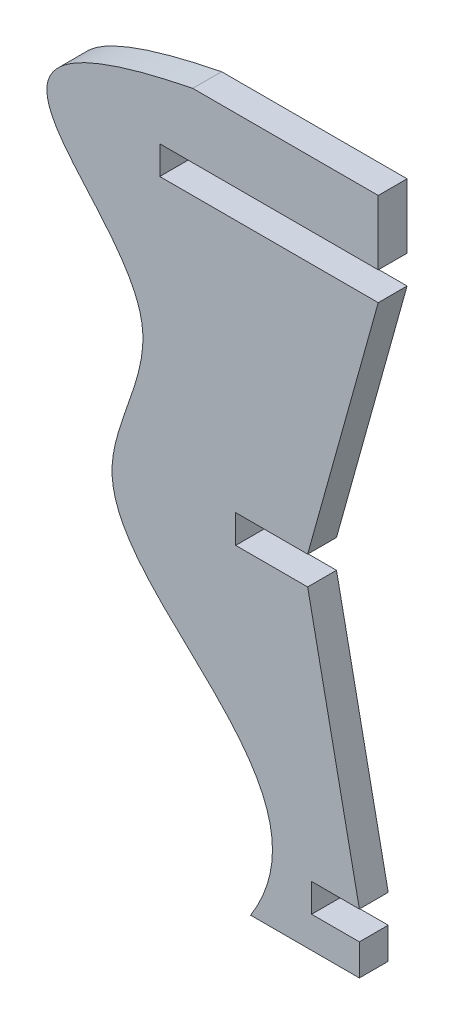
ISO-10303-21;
HEADER;
FILE_DESCRIPTION(('STEP AP214'),'2;1');
FILE_NAME('part.step','',(''),(''),'','','');
FILE_SCHEMA(('AUTOMOTIVE_DESIGN { 1 0 10303 214 1 1 1 1 }'));
ENDSEC;
DATA;
#1=APPLICATION_CONTEXT('core data for automotive mechanical design processes');
#2=APPLICATION_PROTOCOL_DEFINITION('international standard','automotive_design',2000,#1);
#3=PRODUCT_CONTEXT('',#1,'mechanical');
#4=PRODUCT('Part','Part','',(#3));
#5=PRODUCT_RELATED_PRODUCT_CATEGORY('part','',(#4));
#6=PRODUCT_DEFINITION_FORMATION('','',#4);
#7=PRODUCT_DEFINITION_CONTEXT('part definition',#1,'design');
#8=PRODUCT_DEFINITION('design','',#6,#7);
#9=PRODUCT_DEFINITION_SHAPE('','',#8);
#10=(LENGTH_UNIT() NAMED_UNIT(*) SI_UNIT(.MILLI.,.METRE.));
#11=(NAMED_UNIT(*) PLANE_ANGLE_UNIT() SI_UNIT($,.RADIAN.));
#12=(NAMED_UNIT(*) SI_UNIT($,.STERADIAN.) SOLID_ANGLE_UNIT());
#13=UNCERTAINTY_MEASURE_WITH_UNIT(LENGTH_MEASURE(1.E-05),#10,'distance_accuracy_value','');
#14=(GEOMETRIC_REPRESENTATION_CONTEXT(3) GLOBAL_UNCERTAINTY_ASSIGNED_CONTEXT((#13)) GLOBAL_UNIT_ASSIGNED_CONTEXT((#10,
#11,#12)) REPRESENTATION_CONTEXT('',''));
#15=CARTESIAN_POINT('',(0.,0.,0.));
#16=DIRECTION('',(0.,0.,1.));
#17=DIRECTION('',(1.,0.,0.));
#18=AXIS2_PLACEMENT_3D('',#15,#16,#17);
#19=CARTESIAN_POINT('',(-25.8057222674,61.31,5.7));
#20=DIRECTION('',(-0.963245382122219,0.268623032929456,0.));
#21=DIRECTION('',(-0.268623032929456,-0.96324538212222,0.));
#22=AXIS2_PLACEMENT_3D('',#19,#20,#21);
#23=PLANE('',#22);
#24=DIRECTION('',(0.268623032929456,0.963245382122219,0.));
#25=VECTOR('',#24,1.);
#26=CARTESIAN_POINT('',(-25.8057222674,61.31,0.));
#27=LINE('',#26,#25);
#28=CARTESIAN_POINT('',(-25.8057222674,61.31,0.));
#29=VERTEX_POINT('',#28);
#30=CARTESIAN_POINT('',(-11.8620772775,111.31,0.));
#31=VERTEX_POINT('',#30);
#32=EDGE_CURVE('E177',#29,#31,#27,.T.);
#33=ORIENTED_EDGE('',*,*,#32,.T.);
#34=DIRECTION('',(0.,0.,-1.));
#35=VECTOR('',#34,1.);
#36=CARTESIAN_POINT('',(-11.8620772775,111.31,5.7));
#37=LINE('',#36,#35);
#38=CARTESIAN_POINT('',(-11.8620772775,111.31,5.7));
#39=VERTEX_POINT('',#38);
#40=EDGE_CURVE('E11',#39,#31,#37,.T.);
#41=ORIENTED_EDGE('',*,*,#40,.F.);
#42=DIRECTION('',(0.268623032929456,0.963245382122219,0.));
#43=VECTOR('',#42,1.);
#44=CARTESIAN_POINT('',(-25.8057222674,61.31,5.7));
#45=LINE('',#44,#43);
#46=CARTESIAN_POINT('',(-25.8057222674,61.31,5.7));
#47=VERTEX_POINT('',#46);
#48=EDGE_CURVE('E216',#47,#39,#45,.T.);
#49=ORIENTED_EDGE('',*,*,#48,.F.);
#50=DIRECTION('',(0.,0.,-1.));
#51=VECTOR('',#50,1.);
#52=CARTESIAN_POINT('',(-25.8057222674,61.31,5.7));
#53=LINE('',#52,#51);
#54=EDGE_CURVE('E173',#47,#29,#53,.T.);
#55=ORIENTED_EDGE('',*,*,#54,.T.);
#56=EDGE_LOOP('',(#33,#41,#49,#55));
#57=FACE_BOUND('',#56,.T.);
#58=ADVANCED_FACE('F33',(#57),#23,.F.);
#59=CARTESIAN_POINT('',(-11.8620772775,111.31,5.7));
#60=DIRECTION('',(0.,-1.,0.));
#61=DIRECTION('',(0.,0.,-1.));
#62=AXIS2_PLACEMENT_3D('',#59,#60,#61);
#63=PLANE('',#62);
#64=DIRECTION('',(-1.,0.,0.));
#65=VECTOR('',#64,1.);
#66=CARTESIAN_POINT('',(-11.8620772775,111.31,0.));
#67=LINE('',#66,#65);
#68=CARTESIAN_POINT('',(-55.0225,111.31,0.));
#69=VERTEX_POINT('',#68);
#70=EDGE_CURVE('E180',#31,#69,#67,.T.);
#71=ORIENTED_EDGE('',*,*,#70,.T.);
#72=DIRECTION('',(0.,0.,-1.));
#73=VECTOR('',#72,1.);
#74=CARTESIAN_POINT('',(-55.0225,111.31,5.7));
#75=LINE('',#74,#73);
#76=CARTESIAN_POINT('',(-55.0225,111.31,5.7));
#77=VERTEX_POINT('',#76);
#78=EDGE_CURVE('E41',#77,#69,#75,.T.);
#79=ORIENTED_EDGE('',*,*,#78,.F.);
#80=DIRECTION('',(-1.,0.,0.));
#81=VECTOR('',#80,1.);
#82=CARTESIAN_POINT('',(-11.8620772775,111.31,5.7));
#83=LINE('',#82,#81);
#84=EDGE_CURVE('E116',#39,#77,#83,.T.);
#85=ORIENTED_EDGE('',*,*,#84,.F.);
#86=ORIENTED_EDGE('',*,*,#40,.T.);
#87=EDGE_LOOP('',(#71,#79,#85,#86));
#88=FACE_BOUND('',#87,.T.);
#89=ADVANCED_FACE('F303',(#88),#63,.F.);
#90=CARTESIAN_POINT('',(-55.0225,111.31,5.7));
#91=DIRECTION('',(-1.,0.,0.));
#92=DIRECTION('',(0.,0.,1.));
#93=AXIS2_PLACEMENT_3D('',#90,#91,#92);
#94=PLANE('',#93);
#95=DIRECTION('',(0.,1.,0.));
#96=VECTOR('',#95,1.);
#97=CARTESIAN_POINT('',(-55.0225,111.31,0.));
#98=LINE('',#97,#96);
#99=CARTESIAN_POINT('',(-55.0225,116.92,0.));
#100=VERTEX_POINT('',#99);
#101=EDGE_CURVE('E182',#69,#100,#98,.T.);
#102=ORIENTED_EDGE('',*,*,#101,.T.);
#103=DIRECTION('',(0.,0.,-1.));
#104=VECTOR('',#103,1.);
#105=CARTESIAN_POINT('',(-55.0225,116.92,5.7));
#106=LINE('',#105,#104);
#107=CARTESIAN_POINT('',(-55.0225,116.92,5.7));
#108=VERTEX_POINT('',#107);
#109=EDGE_CURVE('E243',#108,#100,#106,.T.);
#110=ORIENTED_EDGE('',*,*,#109,.F.);
#111=DIRECTION('',(0.,1.,0.));
#112=VECTOR('',#111,1.);
#113=CARTESIAN_POINT('',(-55.0225,111.31,5.7));
#114=LINE('',#113,#112);
#115=EDGE_CURVE('E251',#77,#108,#114,.T.);
#116=ORIENTED_EDGE('',*,*,#115,.F.);
#117=ORIENTED_EDGE('',*,*,#78,.T.);
#118=EDGE_LOOP('',(#102,#110,#116,#117));
#119=FACE_BOUND('',#118,.T.);
#120=ADVANCED_FACE('F249',(#119),#94,.F.);
#121=CARTESIAN_POINT('',(-55.0225,116.92,5.7));
#122=DIRECTION('',(0.,1.,0.));
#123=DIRECTION('',(0.,0.,1.));
#124=AXIS2_PLACEMENT_3D('',#121,#122,#123);
#125=PLANE('',#124);
#126=DIRECTION('',(1.,0.,0.));
#127=VECTOR('',#126,1.);
#128=CARTESIAN_POINT('',(-55.0225,116.92,0.));
#129=LINE('',#128,#127);
#130=CARTESIAN_POINT('',(-11.8620772775,116.92,0.));
#131=VERTEX_POINT('',#130);
#132=EDGE_CURVE('E184',#100,#131,#129,.T.);
#133=ORIENTED_EDGE('',*,*,#132,.T.);
#134=DIRECTION('',(0.,0.,-1.));
#135=VECTOR('',#134,1.);
#136=CARTESIAN_POINT('',(-11.8620772775,116.92,5.7));
#137=LINE('',#136,#135);
#138=CARTESIAN_POINT('',(-11.8620772775,116.92,5.7));
#139=VERTEX_POINT('',#138);
#140=EDGE_CURVE('E240',#139,#131,#137,.T.);
#141=ORIENTED_EDGE('',*,*,#140,.F.);
#142=DIRECTION('',(1.,0.,0.));
#143=VECTOR('',#142,1.);
#144=CARTESIAN_POINT('',(-55.0225,116.92,5.7));
#145=LINE('',#144,#143);
#146=EDGE_CURVE('E269',#108,#139,#145,.T.);
#147=ORIENTED_EDGE('',*,*,#146,.F.);
#148=ORIENTED_EDGE('',*,*,#109,.T.);
#149=EDGE_LOOP('',(#133,#141,#147,#148));
#150=FACE_BOUND('',#149,.T.);
#151=ADVANCED_FACE('F260',(#150),#125,.F.);
#152=CARTESIAN_POINT('',(-11.8620772775,116.92,5.7));
#153=DIRECTION('',(-1.,0.,0.));
#154=DIRECTION('',(0.,0.,1.));
#155=AXIS2_PLACEMENT_3D('',#152,#153,#154);
#156=PLANE('',#155);
#157=DIRECTION('',(0.,1.,0.));
#158=VECTOR('',#157,1.);
#159=CARTESIAN_POINT('',(-11.8620772775,116.92,0.));
#160=LINE('',#159,#158);
#161=CARTESIAN_POINT('',(-11.8620772775,129.6505378366,0.));
#162=VERTEX_POINT('',#161);
#163=EDGE_CURVE('E186',#131,#162,#160,.T.);
#164=ORIENTED_EDGE('',*,*,#163,.T.);
#165=DIRECTION('',(0.,0.,-1.));
#166=VECTOR('',#165,1.);
#167=CARTESIAN_POINT('',(-11.8620772775,129.6505378366,5.7));
#168=LINE('',#167,#166);
#169=CARTESIAN_POINT('',(-11.8620772775,129.6505378366,5.7));
#170=VERTEX_POINT('',#169);
#171=EDGE_CURVE('E237',#170,#162,#168,.T.);
#172=ORIENTED_EDGE('',*,*,#171,.F.);
#173=DIRECTION('',(0.,1.,0.));
#174=VECTOR('',#173,1.);
#175=CARTESIAN_POINT('',(-11.8620772775,116.92,5.7));
#176=LINE('',#175,#174);
#177=EDGE_CURVE('E266',#139,#170,#176,.T.);
#178=ORIENTED_EDGE('',*,*,#177,.F.);
#179=ORIENTED_EDGE('',*,*,#140,.T.);
#180=EDGE_LOOP('',(#164,#172,#178,#179));
#181=FACE_BOUND('',#180,.T.);
#182=ADVANCED_FACE('F264',(#181),#156,.F.);
#183=CARTESIAN_POINT('',(-11.8620772775,129.6505378366,5.7));
#184=DIRECTION('',(0.,-1.,0.));
#185=DIRECTION('',(0.,0.,-1.));
#186=AXIS2_PLACEMENT_3D('',#183,#184,#185);
#187=PLANE('',#186);
#188=DIRECTION('',(-1.,0.,0.));
#189=VECTOR('',#188,1.);
#190=CARTESIAN_POINT('',(-11.8620772775,129.6505378366,0.));
#191=LINE('',#190,#189);
#192=CARTESIAN_POINT('',(-48.5078657711,129.6505378366,0.));
#193=VERTEX_POINT('',#192);
#194=EDGE_CURVE('E188',#162,#193,#191,.T.);
#195=ORIENTED_EDGE('',*,*,#194,.T.);
#196=DIRECTION('',(0.,0.,-1.));
#197=VECTOR('',#196,1.);
#198=CARTESIAN_POINT('',(-48.5078657711,129.6505378366,5.7));
#199=LINE('',#198,#197);
#200=CARTESIAN_POINT('',(-48.5078657711,129.6505378366,5.7));
#201=VERTEX_POINT('',#200);
#202=EDGE_CURVE('E235',#201,#193,#199,.T.);
#203=ORIENTED_EDGE('',*,*,#202,.F.);
#204=DIRECTION('',(-1.,0.,0.));
#205=VECTOR('',#204,1.);
#206=CARTESIAN_POINT('',(-11.8620772775,129.6505378366,5.7));
#207=LINE('',#206,#205);
#208=EDGE_CURVE('E268',#170,#201,#207,.T.);
#209=ORIENTED_EDGE('',*,*,#208,.F.);
#210=ORIENTED_EDGE('',*,*,#171,.T.);
#211=EDGE_LOOP('',(#195,#203,#209,#210));
#212=FACE_BOUND('',#211,.T.);
#213=ADVANCED_FACE('F292',(#212),#187,.F.);
#214=CARTESIAN_POINT('',(-37.0751711553,-6.09831367439999,5.7));
#215=CARTESIAN_POINT('',(-18.9326705850336,22.9975941406558,5.7));
#216=CARTESIAN_POINT('',(-82.5226304522793,39.7802684786298,5.7));
#217=CARTESIAN_POINT('',(-40.9715397059702,97.4969415458104,5.7));
#218=CARTESIAN_POINT('',(-105.285323280838,118.285278382174,5.7));
#219=CARTESIAN_POINT('',(-48.5078657711,129.6505378366,5.7));
#220=B_SPLINE_CURVE_WITH_KNOTS('',3,(#214,#215,#216,#217,#218,#219),.UNSPECIFIED.,.F.,.F.,(4,1,
1,4),(0.,0.428706620477407,0.60744609459787,1.),.UNSPECIFIED.);
#221=DIRECTION('',(0.,0.,-1.));
#222=VECTOR('',#221,1.);
#223=SURFACE_OF_LINEAR_EXTRUSION('',#220,#222);
#224=CARTESIAN_POINT('',(-37.0751711553,-6.09831367439999,0.));
#225=CARTESIAN_POINT('',(-18.9326705850336,22.9975941406558,0.));
#226=CARTESIAN_POINT('',(-82.5226304522793,39.7802684786298,0.));
#227=CARTESIAN_POINT('',(-40.9715397059702,97.4969415458104,0.));
#228=CARTESIAN_POINT('',(-105.285323280838,118.285278382174,0.));
#229=CARTESIAN_POINT('',(-48.5078657711,129.6505378366,0.));
#230=B_SPLINE_CURVE_WITH_KNOTS('',3,(#224,#225,#226,#227,#228,#229),.UNSPECIFIED.,.F.,.F.,(4,1,
1,4),(0.,0.428706620477407,0.60744609459787,1.),.UNSPECIFIED.);
#231=CARTESIAN_POINT('',(-37.0751711553,-6.09831367439999,0.));
#232=VERTEX_POINT('',#231);
#233=EDGE_CURVE('E191',#232,#193,#230,.T.);
#234=ORIENTED_EDGE('',*,*,#233,.F.);
#235=DIRECTION('',(0.,0.,-1.));
#236=VECTOR('',#235,1.);
#237=CARTESIAN_POINT('',(-37.0751711553,-6.09831367439999,5.7));
#238=LINE('',#237,#236);
#239=CARTESIAN_POINT('',(-37.0751711553,-6.09831367439999,5.7));
#240=VERTEX_POINT('',#239);
#241=EDGE_CURVE('E233',#240,#232,#238,.T.);
#242=ORIENTED_EDGE('',*,*,#241,.F.);
#243=EDGE_CURVE('E271',#240,#201,#220,.T.);
#244=ORIENTED_EDGE('',*,*,#243,.T.);
#245=ORIENTED_EDGE('',*,*,#202,.T.);
#246=EDGE_LOOP('',(#234,#242,#244,#245));
#247=FACE_BOUND('',#246,.T.);
#248=ADVANCED_FACE('F287',(#247),#223,.T.);
#249=CARTESIAN_POINT('',(-15.5909572032,-6.09831367440001,5.7));
#250=DIRECTION('',(0.,-1.,0.));
#251=DIRECTION('',(0.,0.,-1.));
#252=AXIS2_PLACEMENT_3D('',#249,#250,#251);
#253=PLANE('',#252);
#254=DIRECTION('',(-1.,0.,0.));
#255=VECTOR('',#254,1.);
#256=CARTESIAN_POINT('',(-15.5909572032,-6.09831367440001,0.));
#257=LINE('',#256,#255);
#258=CARTESIAN_POINT('',(-15.5909572032,-6.09831367440001,0.));
#259=VERTEX_POINT('',#258);
#260=EDGE_CURVE('E196',#259,#232,#257,.T.);
#261=ORIENTED_EDGE('',*,*,#260,.F.);
#262=DIRECTION('',(0.,0.,-1.));
#263=VECTOR('',#262,1.);
#264=CARTESIAN_POINT('',(-15.5909572032,-6.09831367440001,5.7));
#265=LINE('',#264,#263);
#266=CARTESIAN_POINT('',(-15.5909572032,-6.09831367440001,5.7));
#267=VERTEX_POINT('',#266);
#268=EDGE_CURVE('E231',#267,#259,#265,.T.);
#269=ORIENTED_EDGE('',*,*,#268,.F.);
#270=DIRECTION('',(-1.,0.,0.));
#271=VECTOR('',#270,1.);
#272=CARTESIAN_POINT('',(-15.5909572032,-6.09831367440001,5.7));
#273=LINE('',#272,#271);
#274=EDGE_CURVE('E281',#267,#240,#273,.T.);
#275=ORIENTED_EDGE('',*,*,#274,.T.);
#276=ORIENTED_EDGE('',*,*,#241,.T.);
#277=EDGE_LOOP('',(#261,#269,#275,#276));
#278=FACE_BOUND('',#277,.T.);
#279=ADVANCED_FACE('F291',(#278),#253,.T.);
#280=CARTESIAN_POINT('',(-15.5909572032,0.089999999999989,5.7));
#281=DIRECTION('',(1.,0.,0.));
#282=DIRECTION('',(0.,0.,-1.));
#283=AXIS2_PLACEMENT_3D('',#280,#281,#282);
#284=PLANE('',#283);
#285=DIRECTION('',(0.,-1.,0.));
#286=VECTOR('',#285,1.);
#287=CARTESIAN_POINT('',(-15.5909572032,0.089999999999989,0.));
#288=LINE('',#287,#286);
#289=CARTESIAN_POINT('',(-15.5909572032,0.089999999999989,0.));
#290=VERTEX_POINT('',#289);
#291=EDGE_CURVE('E202',#290,#259,#288,.T.);
#292=ORIENTED_EDGE('',*,*,#291,.F.);
#293=DIRECTION('',(0.,0.,-1.));
#294=VECTOR('',#293,1.);
#295=CARTESIAN_POINT('',(-15.5909572032,0.089999999999989,5.7));
#296=LINE('',#295,#294);
#297=CARTESIAN_POINT('',(-15.5909572032,0.089999999999989,5.7));
#298=VERTEX_POINT('',#297);
#299=EDGE_CURVE('E229',#298,#290,#296,.T.);
#300=ORIENTED_EDGE('',*,*,#299,.F.);
#301=DIRECTION('',(0.,-1.,0.));
#302=VECTOR('',#301,1.);
#303=CARTESIAN_POINT('',(-15.5909572032,0.089999999999989,5.7));
#304=LINE('',#303,#302);
#305=EDGE_CURVE('E336',#298,#267,#304,.T.);
#306=ORIENTED_EDGE('',*,*,#305,.T.);
#307=ORIENTED_EDGE('',*,*,#268,.T.);
#308=EDGE_LOOP('',(#292,#300,#306,#307));
#309=FACE_BOUND('',#308,.T.);
#310=ADVANCED_FACE('F331',(#309),#284,.T.);
#311=CARTESIAN_POINT('',(-15.5909572032,0.089999999999989,5.7));
#312=DIRECTION('',(0.,-1.,0.));
#313=DIRECTION('',(0.,0.,-1.));
#314=AXIS2_PLACEMENT_3D('',#311,#312,#313);
#315=PLANE('',#314);
#316=DIRECTION('',(-1.,0.,0.));
#317=VECTOR('',#316,1.);
#318=CARTESIAN_POINT('',(-15.5909572032,0.089999999999989,0.));
#319=LINE('',#318,#317);
#320=CARTESIAN_POINT('',(-25.0225,0.089999999999989,0.));
#321=VERTEX_POINT('',#320);
#322=EDGE_CURVE('E205',#290,#321,#319,.T.);
#323=ORIENTED_EDGE('',*,*,#322,.T.);
#324=DIRECTION('',(0.,0.,-1.));
#325=VECTOR('',#324,1.);
#326=CARTESIAN_POINT('',(-25.0225,0.089999999999989,5.7));
#327=LINE('',#326,#325);
#328=CARTESIAN_POINT('',(-25.0225,0.089999999999989,5.7));
#329=VERTEX_POINT('',#328);
#330=EDGE_CURVE('E226',#329,#321,#327,.T.);
#331=ORIENTED_EDGE('',*,*,#330,.F.);
#332=DIRECTION('',(-1.,0.,0.));
#333=VECTOR('',#332,1.);
#334=CARTESIAN_POINT('',(-15.5909572032,0.089999999999989,5.7));
#335=LINE('',#334,#333);
#336=EDGE_CURVE('E343',#298,#329,#335,.T.);
#337=ORIENTED_EDGE('',*,*,#336,.F.);
#338=ORIENTED_EDGE('',*,*,#299,.T.);
#339=EDGE_LOOP('',(#323,#331,#337,#338));
#340=FACE_BOUND('',#339,.T.);
#341=ADVANCED_FACE('F347',(#340),#315,.F.);
#342=CARTESIAN_POINT('',(-25.0225,0.089999999999989,5.7));
#343=DIRECTION('',(-1.,0.,0.));
#344=DIRECTION('',(0.,0.,1.));
#345=AXIS2_PLACEMENT_3D('',#342,#343,#344);
#346=PLANE('',#345);
#347=DIRECTION('',(0.,1.,0.));
#348=VECTOR('',#347,1.);
#349=CARTESIAN_POINT('',(-25.0225,0.089999999999989,0.));
#350=LINE('',#349,#348);
#351=CARTESIAN_POINT('',(-25.0225,5.69999999999999,0.));
#352=VERTEX_POINT('',#351);
#353=EDGE_CURVE('E207',#321,#352,#350,.T.);
#354=ORIENTED_EDGE('',*,*,#353,.T.);
#355=DIRECTION('',(0.,0.,-1.));
#356=VECTOR('',#355,1.);
#357=CARTESIAN_POINT('',(-25.0225,5.69999999999999,5.7));
#358=LINE('',#357,#356);
#359=CARTESIAN_POINT('',(-25.0225,5.69999999999999,5.7));
#360=VERTEX_POINT('',#359);
#361=EDGE_CURVE('E223',#360,#352,#358,.T.);
#362=ORIENTED_EDGE('',*,*,#361,.F.);
#363=DIRECTION('',(0.,1.,0.));
#364=VECTOR('',#363,1.);
#365=CARTESIAN_POINT('',(-25.0225,0.089999999999989,5.7));
#366=LINE('',#365,#364);
#367=EDGE_CURVE('E325',#329,#360,#366,.T.);
#368=ORIENTED_EDGE('',*,*,#367,.F.);
#369=ORIENTED_EDGE('',*,*,#330,.T.);
#370=EDGE_LOOP('',(#354,#362,#368,#369));
#371=FACE_BOUND('',#370,.T.);
#372=ADVANCED_FACE('F324',(#371),#346,.F.);
#373=CARTESIAN_POINT('',(-25.0225,5.69999999999999,5.7));
#374=DIRECTION('',(0.,1.,0.));
#375=DIRECTION('',(-1.,0.,0.));
#376=AXIS2_PLACEMENT_3D('',#373,#374,#375);
#377=PLANE('',#376);
#378=DIRECTION('',(1.,0.,0.));
#379=VECTOR('',#378,1.);
#380=CARTESIAN_POINT('',(-25.0225,5.69999999999999,0.));
#381=LINE('',#380,#379);
#382=CARTESIAN_POINT('',(-15.5909572032,5.69999999999999,0.));
#383=VERTEX_POINT('',#382);
#384=EDGE_CURVE('E209',#352,#383,#381,.T.);
#385=ORIENTED_EDGE('',*,*,#384,.T.);
#386=DIRECTION('',(0.,0.,-1.));
#387=VECTOR('',#386,1.);
#388=CARTESIAN_POINT('',(-15.5909572032,5.69999999999999,5.7));
#389=LINE('',#388,#387);
#390=CARTESIAN_POINT('',(-15.5909572032,5.69999999999999,5.7));
#391=VERTEX_POINT('',#390);
#392=EDGE_CURVE('E220',#391,#383,#389,.T.);
#393=ORIENTED_EDGE('',*,*,#392,.F.);
#394=DIRECTION('',(1.,0.,0.));
#395=VECTOR('',#394,1.);
#396=CARTESIAN_POINT('',(-25.0225,5.69999999999999,5.7));
#397=LINE('',#396,#395);
#398=EDGE_CURVE('E320',#360,#391,#397,.T.);
#399=ORIENTED_EDGE('',*,*,#398,.F.);
#400=ORIENTED_EDGE('',*,*,#361,.T.);
#401=EDGE_LOOP('',(#385,#393,#399,#400));
#402=FACE_BOUND('',#401,.T.);
#403=ADVANCED_FACE('F319',(#402),#377,.F.);
#404=CARTESIAN_POINT('',(-15.5909572032,5.69999999999999,5.7));
#405=DIRECTION('',(-0.979763023028621,-0.200160981976555,0.));
#406=DIRECTION('',(0.200160981976555,-0.979763023028621,0.));
#407=AXIS2_PLACEMENT_3D('',#404,#405,#406);
#408=PLANE('',#407);
#409=DIRECTION('',(-0.200160981976555,0.979763023028621,0.));
#410=VECTOR('',#409,1.);
#411=CARTESIAN_POINT('',(-15.5909572032,5.69999999999999,0.));
#412=LINE('',#411,#410);
#413=CARTESIAN_POINT('',(-25.8057222674,55.7,0.));
#414=VERTEX_POINT('',#413);
#415=EDGE_CURVE('E211',#383,#414,#412,.T.);
#416=ORIENTED_EDGE('',*,*,#415,.T.);
#417=DIRECTION('',(0.,0.,-1.));
#418=VECTOR('',#417,1.);
#419=CARTESIAN_POINT('',(-25.8057222674,55.7,5.7));
#420=LINE('',#419,#418);
#421=CARTESIAN_POINT('',(-25.8057222674,55.7,5.7));
#422=VERTEX_POINT('',#421);
#423=EDGE_CURVE('E168',#422,#414,#420,.T.);
#424=ORIENTED_EDGE('',*,*,#423,.F.);
#425=DIRECTION('',(-0.200160981976555,0.979763023028621,0.));
#426=VECTOR('',#425,1.);
#427=CARTESIAN_POINT('',(-15.5909572032,5.69999999999999,5.7));
#428=LINE('',#427,#426);
#429=EDGE_CURVE('E159',#391,#422,#428,.T.);
#430=ORIENTED_EDGE('',*,*,#429,.F.);
#431=ORIENTED_EDGE('',*,*,#392,.T.);
#432=EDGE_LOOP('',(#416,#424,#430,#431));
#433=FACE_BOUND('',#432,.T.);
#434=ADVANCED_FACE('F315',(#433),#408,.F.);
#435=CARTESIAN_POINT('',(-25.8057222674,55.7,5.7));
#436=DIRECTION('',(0.,-1.,0.));
#437=DIRECTION('',(0.,0.,-1.));
#438=AXIS2_PLACEMENT_3D('',#435,#436,#437);
#439=PLANE('',#438);
#440=DIRECTION('',(-1.,0.,0.));
#441=VECTOR('',#440,1.);
#442=CARTESIAN_POINT('',(-25.8057222674,55.7,0.));
#443=LINE('',#442,#441);
#444=CARTESIAN_POINT('',(-40.0225,55.7,0.));
#445=VERTEX_POINT('',#444);
#446=EDGE_CURVE('E167',#414,#445,#443,.T.);
#447=ORIENTED_EDGE('',*,*,#446,.T.);
#448=DIRECTION('',(0.,0.,-1.));
#449=VECTOR('',#448,1.);
#450=CARTESIAN_POINT('',(-40.0225,55.7,5.7));
#451=LINE('',#450,#449);
#452=CARTESIAN_POINT('',(-40.0225,55.7,5.7));
#453=VERTEX_POINT('',#452);
#454=EDGE_CURVE('E164',#453,#445,#451,.T.);
#455=ORIENTED_EDGE('',*,*,#454,.F.);
#456=DIRECTION('',(-1.,0.,0.));
#457=VECTOR('',#456,1.);
#458=CARTESIAN_POINT('',(-25.8057222674,55.7,5.7));
#459=LINE('',#458,#457);
#460=EDGE_CURVE('E153',#422,#453,#459,.T.);
#461=ORIENTED_EDGE('',*,*,#460,.F.);
#462=ORIENTED_EDGE('',*,*,#423,.T.);
#463=EDGE_LOOP('',(#447,#455,#461,#462));
#464=FACE_BOUND('',#463,.T.);
#465=ADVANCED_FACE('F165',(#464),#439,.F.);
#466=CARTESIAN_POINT('',(-40.0225,55.7,5.7));
#467=DIRECTION('',(-1.,0.,0.));
#468=DIRECTION('',(0.,0.,1.));
#469=AXIS2_PLACEMENT_3D('',#466,#467,#468);
#470=PLANE('',#469);
#471=DIRECTION('',(0.,1.,0.));
#472=VECTOR('',#471,1.);
#473=CARTESIAN_POINT('',(-40.0225,55.7,0.));
#474=LINE('',#473,#472);
#475=CARTESIAN_POINT('',(-40.0225,61.31,0.));
#476=VERTEX_POINT('',#475);
#477=EDGE_CURVE('E102',#445,#476,#474,.T.);
#478=ORIENTED_EDGE('',*,*,#477,.T.);
#479=DIRECTION('',(0.,0.,-1.));
#480=VECTOR('',#479,1.);
#481=CARTESIAN_POINT('',(-40.0225,61.31,5.7));
#482=LINE('',#481,#480);
#483=CARTESIAN_POINT('',(-40.0225,61.31,5.7));
#484=VERTEX_POINT('',#483);
#485=EDGE_CURVE('E169',#484,#476,#482,.T.);
#486=ORIENTED_EDGE('',*,*,#485,.F.);
#487=DIRECTION('',(0.,1.,0.));
#488=VECTOR('',#487,1.);
#489=CARTESIAN_POINT('',(-40.0225,55.7,5.7));
#490=LINE('',#489,#488);
#491=EDGE_CURVE('E157',#453,#484,#490,.T.);
#492=ORIENTED_EDGE('',*,*,#491,.F.);
#493=ORIENTED_EDGE('',*,*,#454,.T.);
#494=EDGE_LOOP('',(#478,#486,#492,#493));
#495=FACE_BOUND('',#494,.T.);
#496=ADVANCED_FACE('F171',(#495),#470,.F.);
#497=CARTESIAN_POINT('',(-40.0225,61.31,5.7));
#498=DIRECTION('',(0.,1.,0.));
#499=DIRECTION('',(0.,0.,1.));
#500=AXIS2_PLACEMENT_3D('',#497,#498,#499);
#501=PLANE('',#500);
#502=DIRECTION('',(1.,0.,0.));
#503=VECTOR('',#502,1.);
#504=CARTESIAN_POINT('',(-40.0225,61.31,0.));
#505=LINE('',#504,#503);
#506=EDGE_CURVE('E108',#476,#29,#505,.T.);
#507=ORIENTED_EDGE('',*,*,#506,.T.);
#508=ORIENTED_EDGE('',*,*,#54,.F.);
#509=DIRECTION('',(1.,0.,0.));
#510=VECTOR('',#509,1.);
#511=CARTESIAN_POINT('',(-40.0225,61.31,5.7));
#512=LINE('',#511,#510);
#513=EDGE_CURVE('E49',#484,#47,#512,.T.);
#514=ORIENTED_EDGE('',*,*,#513,.F.);
#515=ORIENTED_EDGE('',*,*,#485,.T.);
#516=EDGE_LOOP('',(#507,#508,#514,#515));
#517=FACE_BOUND('',#516,.T.);
#518=ADVANCED_FACE('F364',(#517),#501,.F.);
#519=CARTESIAN_POINT('',(-62.1255289654986,66.8200527387078,5.7));
#520=DIRECTION('',(0.,0.,-1.));
#521=DIRECTION('',(-1.,0.,0.));
#522=AXIS2_PLACEMENT_3D('',#519,#520,#521);
#523=PLANE('',#522);
#524=ORIENTED_EDGE('',*,*,#48,.T.);
#525=ORIENTED_EDGE('',*,*,#84,.T.);
#526=ORIENTED_EDGE('',*,*,#115,.T.);
#527=ORIENTED_EDGE('',*,*,#146,.T.);
#528=ORIENTED_EDGE('',*,*,#177,.T.);
#529=ORIENTED_EDGE('',*,*,#208,.T.);
#530=ORIENTED_EDGE('',*,*,#243,.F.);
#531=ORIENTED_EDGE('',*,*,#274,.F.);
#532=ORIENTED_EDGE('',*,*,#305,.F.);
#533=ORIENTED_EDGE('',*,*,#336,.T.);
#534=ORIENTED_EDGE('',*,*,#367,.T.);
#535=ORIENTED_EDGE('',*,*,#398,.T.);
#536=ORIENTED_EDGE('',*,*,#429,.T.);
#537=ORIENTED_EDGE('',*,*,#460,.T.);
#538=ORIENTED_EDGE('',*,*,#491,.T.);
#539=ORIENTED_EDGE('',*,*,#513,.T.);
#540=EDGE_LOOP('',(#524,#525,#526,#527,#528,#529,#530,#531,#532,#533,#534,#535,#536,#537,#538,#539));
#541=FACE_BOUND('',#540,.T.);
#542=ADVANCED_FACE('F155',(#541),#523,.F.);
#543=CARTESIAN_POINT('',(-62.1255289654986,66.8200527387078,0.));
#544=DIRECTION('',(0.,0.,-1.));
#545=DIRECTION('',(-1.,0.,0.));
#546=AXIS2_PLACEMENT_3D('',#543,#544,#545);
#547=PLANE('',#546);
#548=ORIENTED_EDGE('',*,*,#32,.F.);
#549=ORIENTED_EDGE('',*,*,#506,.F.);
#550=ORIENTED_EDGE('',*,*,#477,.F.);
#551=ORIENTED_EDGE('',*,*,#446,.F.);
#552=ORIENTED_EDGE('',*,*,#415,.F.);
#553=ORIENTED_EDGE('',*,*,#384,.F.);
#554=ORIENTED_EDGE('',*,*,#353,.F.);
#555=ORIENTED_EDGE('',*,*,#322,.F.);
#556=ORIENTED_EDGE('',*,*,#291,.T.);
#557=ORIENTED_EDGE('',*,*,#260,.T.);
#558=ORIENTED_EDGE('',*,*,#233,.T.);
#559=ORIENTED_EDGE('',*,*,#194,.F.);
#560=ORIENTED_EDGE('',*,*,#163,.F.);
#561=ORIENTED_EDGE('',*,*,#132,.F.);
#562=ORIENTED_EDGE('',*,*,#101,.F.);
#563=ORIENTED_EDGE('',*,*,#70,.F.);
#564=EDGE_LOOP('',(#548,#549,#550,#551,#552,#553,#554,#555,#556,#557,#558,#559,#560,#561,#562,#563));
#565=FACE_BOUND('',#564,.T.);
#566=ADVANCED_FACE('F255',(#565),#547,.T.);
#567=CLOSED_SHELL('',(#58,#89,#120,#151,#182,#213,#248,#279,#310,#341,#372,#403,#434,#465,#496,
#518,#542,#566));
#568=MANIFOLD_SOLID_BREP('B2',#567);
#569=ADVANCED_BREP_SHAPE_REPRESENTATION('',(#18,#568),#14);
#570=SHAPE_DEFINITION_REPRESENTATION(#9,#569);
ENDSEC;
END-ISO-10303-21;
